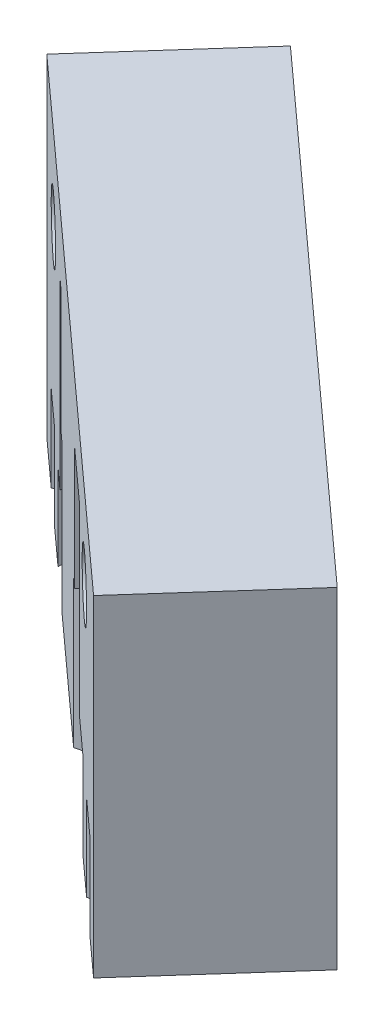
ISO-10303-21;
HEADER;
FILE_DESCRIPTION(('STEP AP214'),'2;1');
FILE_NAME('part.step','',(''),(''),'','','');
FILE_SCHEMA(('AUTOMOTIVE_DESIGN { 1 0 10303 214 1 1 1 1 }'));
ENDSEC;
DATA;
#1=APPLICATION_CONTEXT('core data for automotive mechanical design processes');
#2=APPLICATION_PROTOCOL_DEFINITION('international standard','automotive_design',2000,#1);
#3=PRODUCT_CONTEXT('',#1,'mechanical');
#4=PRODUCT('Part','Part','',(#3));
#5=PRODUCT_RELATED_PRODUCT_CATEGORY('part','',(#4));
#6=PRODUCT_DEFINITION_FORMATION('','',#4);
#7=PRODUCT_DEFINITION_CONTEXT('part definition',#1,'design');
#8=PRODUCT_DEFINITION('design','',#6,#7);
#9=PRODUCT_DEFINITION_SHAPE('','',#8);
#10=(LENGTH_UNIT() NAMED_UNIT(*) SI_UNIT(.MILLI.,.METRE.));
#11=(NAMED_UNIT(*) PLANE_ANGLE_UNIT() SI_UNIT($,.RADIAN.));
#12=(NAMED_UNIT(*) SI_UNIT($,.STERADIAN.) SOLID_ANGLE_UNIT());
#13=UNCERTAINTY_MEASURE_WITH_UNIT(LENGTH_MEASURE(1.E-05),#10,'distance_accuracy_value','');
#14=(GEOMETRIC_REPRESENTATION_CONTEXT(3) GLOBAL_UNCERTAINTY_ASSIGNED_CONTEXT((#13)) GLOBAL_UNIT_ASSIGNED_CONTEXT((#10,
#11,#12)) REPRESENTATION_CONTEXT('',''));
#15=CARTESIAN_POINT('',(0.,0.,0.));
#16=DIRECTION('',(0.,0.,1.));
#17=DIRECTION('',(1.,0.,0.));
#18=AXIS2_PLACEMENT_3D('',#15,#16,#17);
#19=CARTESIAN_POINT('',(0.180321334409129,0.,-0.199266915510276));
#20=DIRECTION('',(0.670979247329059,0.,-0.74147612884956));
#21=DIRECTION('',(-0.74147612884956,0.,-0.670979247329059));
#22=AXIS2_PLACEMENT_3D('',#19,#20,#21);
#23=PLANE('',#22);
#24=CARTESIAN_POINT('',(14.4574317839117,20.2282122973391,12.7204272603554));
#25=DIRECTION('',(0.670979247329059,0.,-0.74147612884956));
#26=DIRECTION('',(-0.74147612884956,0.,-0.670979247329059));
#27=AXIS2_PLACEMENT_3D('',#24,#25,#26);
#28=CIRCLE('',#27,2.5);
#29=CARTESIAN_POINT('',(12.6037414617879,20.2282122973391,11.0429791420328));
#30=VERTEX_POINT('',#29);
#31=EDGE_CURVE('E45',#30,#30,#28,.F.);
#32=ORIENTED_EDGE('',*,*,#31,.F.);
#33=EDGE_LOOP('',(#32));
#34=FACE_BOUND('',#33,.T.);
#35=CARTESIAN_POINT('',(-12.0858954641083,20.2282122973391,-11.299255970875));
#36=DIRECTION('',(0.670979247329059,0.,-0.74147612884956));
#37=DIRECTION('',(-0.74147612884956,0.,-0.670979247329059));
#38=AXIS2_PLACEMENT_3D('',#35,#36,#37);
#39=CIRCLE('',#38,2.5);
#40=CARTESIAN_POINT('',(-13.9395857862322,20.2282122973391,-12.9767040891976));
#41=VERTEX_POINT('',#40);
#42=EDGE_CURVE('E515',#41,#41,#39,.F.);
#43=ORIENTED_EDGE('',*,*,#42,.F.);
#44=EDGE_LOOP('',(#43));
#45=FACE_BOUND('',#44,.T.);
#46=DIRECTION('',(0.,-1.,0.));
#47=VECTOR('',#46,1.);
#48=CARTESIAN_POINT('',(-17.7575242155149,27.,-16.4316466746096));
#49=LINE('',#48,#47);
#50=CARTESIAN_POINT('',(-17.7575242155149,27.,-16.4316466746096));
#51=VERTEX_POINT('',#50);
#52=CARTESIAN_POINT('',(-17.7575242155149,0.,-16.4316466746096));
#53=VERTEX_POINT('',#52);
#54=EDGE_CURVE('E231',#51,#53,#49,.T.);
#55=ORIENTED_EDGE('',*,*,#54,.T.);
#56=DIRECTION('',(0.74147612884956,0.,0.670979247329059));
#57=VECTOR('',#56,1.);
#58=CARTESIAN_POINT('',(0.180321334409129,0.,-0.199266915510276));
#59=LINE('',#58,#57);
#60=CARTESIAN_POINT('',(-13.9430557088245,0.,-12.9798441040392));
#61=VERTEX_POINT('',#60);
#62=EDGE_CURVE('E508',#53,#61,#59,.T.);
#63=ORIENTED_EDGE('',*,*,#62,.T.);
#64=DIRECTION('',(0.,-1.,0.));
#65=VECTOR('',#64,1.);
#66=CARTESIAN_POINT('',(-13.9430557088245,7.,-12.9798441040392));
#67=LINE('',#66,#65);
#68=CARTESIAN_POINT('',(-13.9430557088245,7.,-12.9798441040392));
#69=VERTEX_POINT('',#68);
#70=EDGE_CURVE('E502',#61,#69,#67,.F.);
#71=ORIENTED_EDGE('',*,*,#70,.T.);
#72=DIRECTION('',(-0.74147612884956,0.,-0.670979247329059));
#73=VECTOR('',#72,1.);
#74=CARTESIAN_POINT('',(0.180321334409129,7.,-0.199266915510276));
#75=LINE('',#74,#73);
#76=CARTESIAN_POINT('',(-11.0968622551529,7.,-10.4042564795792));
#77=VERTEX_POINT('',#76);
#78=EDGE_CURVE('E486',#77,#69,#75,.T.);
#79=ORIENTED_EDGE('',*,*,#78,.F.);
#80=DIRECTION('',(0.,-1.,0.));
#81=VECTOR('',#80,1.);
#82=CARTESIAN_POINT('',(-11.0968622551529,7.,-10.4042564795792));
#83=LINE('',#82,#81);
#84=CARTESIAN_POINT('',(-11.0968622551529,0.,-10.4042564795792));
#85=VERTEX_POINT('',#84);
#86=EDGE_CURVE('E478',#85,#77,#83,.F.);
#87=ORIENTED_EDGE('',*,*,#86,.F.);
#88=DIRECTION('',(0.74147612884956,0.,0.670979247329059));
#89=VECTOR('',#88,1.);
#90=CARTESIAN_POINT('',(0.180321334409129,0.,-0.199266915510276));
#91=LINE('',#90,#89);
#92=CARTESIAN_POINT('',(-8.11647189445451,0.,-7.7072309069947));
#93=VERTEX_POINT('',#92);
#94=EDGE_CURVE('E490',#85,#93,#91,.T.);
#95=ORIENTED_EDGE('',*,*,#94,.T.);
#96=DIRECTION('',(0.,-1.,0.));
#97=VECTOR('',#96,1.);
#98=CARTESIAN_POINT('',(-8.11647189445451,7.,-7.7072309069947));
#99=LINE('',#98,#97);
#100=CARTESIAN_POINT('',(-8.11647189445451,7.,-7.7072309069947));
#101=VERTEX_POINT('',#100);
#102=EDGE_CURVE('E483',#101,#93,#99,.T.);
#103=ORIENTED_EDGE('',*,*,#102,.F.);
#104=CARTESIAN_POINT('',(-6.45742945742896,7.,-6.20592425345544));
#105=VERTEX_POINT('',#104);
#106=EDGE_CURVE('E470',#105,#101,#75,.T.);
#107=ORIENTED_EDGE('',*,*,#106,.F.);
#108=DIRECTION('',(0.,-1.,0.));
#109=VECTOR('',#108,1.);
#110=CARTESIAN_POINT('',(-6.45742945742896,22.,-6.20592425345544));
#111=LINE('',#110,#109);
#112=CARTESIAN_POINT('',(-6.45742945742896,22.,-6.20592425345544));
#113=VERTEX_POINT('',#112);
#114=EDGE_CURVE('E467',#113,#105,#111,.T.);
#115=ORIENTED_EDGE('',*,*,#114,.F.);
#116=DIRECTION('',(-0.74147612884956,0.,-0.670979247329059));
#117=VECTOR('',#116,1.);
#118=CARTESIAN_POINT('',(0.180321334409129,22.,-0.199266915510276));
#119=LINE('',#118,#117);
#120=CARTESIAN_POINT('',(-5.74813977065192,22.,-5.56407127713598));
#121=VERTEX_POINT('',#120);
#122=EDGE_CURVE('E466',#121,#113,#119,.T.);
#123=ORIENTED_EDGE('',*,*,#122,.F.);
#124=DIRECTION('',(0.,1.,0.));
#125=VECTOR('',#124,1.);
#126=CARTESIAN_POINT('',(-5.74813977065192,12.,-5.56407127713598));
#127=LINE('',#126,#125);
#128=CARTESIAN_POINT('',(-5.74813977065192,12.,-5.56407127713598));
#129=VERTEX_POINT('',#128);
#130=EDGE_CURVE('E455',#121,#129,#127,.F.);
#131=ORIENTED_EDGE('',*,*,#130,.T.);
#132=DIRECTION('',(-0.74147612884956,0.,-0.670979247329059));
#133=VECTOR('',#132,1.);
#134=CARTESIAN_POINT('',(0.180321334409129,12.,-0.199266915510276));
#135=LINE('',#134,#133);
#136=CARTESIAN_POINT('',(-4.63515238000912,12.,-4.55690272159674));
#137=VERTEX_POINT('',#136);
#138=EDGE_CURVE('E451',#137,#129,#135,.T.);
#139=ORIENTED_EDGE('',*,*,#138,.F.);
#140=DIRECTION('',(0.,-1.,0.));
#141=VECTOR('',#140,1.);
#142=CARTESIAN_POINT('',(-4.63515238000912,7.,-4.55690272159674));
#143=LINE('',#142,#141);
#144=CARTESIAN_POINT('',(-4.63515238000912,0.,-4.55690272159674));
#145=VERTEX_POINT('',#144);
#146=EDGE_CURVE('E444',#145,#137,#143,.F.);
#147=ORIENTED_EDGE('',*,*,#146,.F.);
#148=DIRECTION('',(0.74147612884956,0.,0.670979247329059));
#149=VECTOR('',#148,1.);
#150=CARTESIAN_POINT('',(0.180321334409129,0.,-0.199266915510276));
#151=LINE('',#150,#149);
#152=CARTESIAN_POINT('',(5.2950846684095,0.,4.42920313036783));
#153=VERTEX_POINT('',#152);
#154=EDGE_CURVE('E12',#145,#153,#151,.T.);
#155=ORIENTED_EDGE('',*,*,#154,.T.);
#156=DIRECTION('',(0.,-1.,0.));
#157=VECTOR('',#156,1.);
#158=CARTESIAN_POINT('',(5.2950846684095,7.,4.42920313036783));
#159=LINE('',#158,#157);
#160=CARTESIAN_POINT('',(5.2950846684095,12.,4.42920313036783));
#161=VERTEX_POINT('',#160);
#162=EDGE_CURVE('E65',#161,#153,#159,.T.);
#163=ORIENTED_EDGE('',*,*,#162,.F.);
#164=DIRECTION('',(-0.74147612884956,0.,-0.670979247329059));
#165=VECTOR('',#164,1.);
#166=CARTESIAN_POINT('',(0.180321334409129,12.,-0.199266915510276));
#167=LINE('',#166,#165);
#168=CARTESIAN_POINT('',(6.10878243947018,12.,5.16553744611543));
#169=VERTEX_POINT('',#168);
#170=EDGE_CURVE('E448',#169,#161,#167,.T.);
#171=ORIENTED_EDGE('',*,*,#170,.F.);
#172=DIRECTION('',(0.,1.,0.));
#173=VECTOR('',#172,1.);
#174=CARTESIAN_POINT('',(6.10878243947018,12.,5.16553744611543));
#175=LINE('',#174,#173);
#176=CARTESIAN_POINT('',(6.10878243947018,22.,5.16553744611543));
#177=VERTEX_POINT('',#176);
#178=EDGE_CURVE('E456',#169,#177,#175,.T.);
#179=ORIENTED_EDGE('',*,*,#178,.T.);
#180=CARTESIAN_POINT('',(10.1268477535171,22.,8.80157957240914));
#181=VERTEX_POINT('',#180);
#182=EDGE_CURVE('E452',#181,#177,#119,.T.);
#183=ORIENTED_EDGE('',*,*,#182,.F.);
#184=DIRECTION('',(0.,-1.,0.));
#185=VECTOR('',#184,1.);
#186=CARTESIAN_POINT('',(10.1268477535171,22.,8.80157957240913));
#187=LINE('',#186,#185);
#188=CARTESIAN_POINT('',(10.1268477535171,7.,8.80157957240913));
#189=VERTEX_POINT('',#188);
#190=EDGE_CURVE('E460',#181,#189,#187,.T.);
#191=ORIENTED_EDGE('',*,*,#190,.T.);
#192=DIRECTION('',(-0.74147612884956,0.,-0.670979247329059));
#193=VECTOR('',#192,1.);
#194=CARTESIAN_POINT('',(0.180321334409129,7.,-0.199266915510276));
#195=LINE('',#194,#193);
#196=CARTESIAN_POINT('',(13.5040535540342,7.,11.8576928010605));
#197=VERTEX_POINT('',#196);
#198=EDGE_CURVE('E447',#197,#189,#195,.T.);
#199=ORIENTED_EDGE('',*,*,#198,.F.);
#200=DIRECTION('',(0.,-1.,0.));
#201=VECTOR('',#200,1.);
#202=CARTESIAN_POINT('',(13.5040535540342,7.,11.8576928010605));
#203=LINE('',#202,#201);
#204=CARTESIAN_POINT('',(13.5040535540342,0.,11.8576928010605));
#205=VERTEX_POINT('',#204);
#206=EDGE_CURVE('E479',#205,#197,#203,.F.);
#207=ORIENTED_EDGE('',*,*,#206,.F.);
#208=DIRECTION('',(0.74147612884956,0.,0.670979247329059));
#209=VECTOR('',#208,1.);
#210=CARTESIAN_POINT('',(0.180321334409129,0.,-0.199266915510276));
#211=LINE('',#210,#209);
#212=CARTESIAN_POINT('',(16.3901305800542,0.,14.4693720113638));
#213=VERTEX_POINT('',#212);
#214=EDGE_CURVE('E51',#205,#213,#211,.T.);
#215=ORIENTED_EDGE('',*,*,#214,.T.);
#216=DIRECTION('',(0.,-1.,0.));
#217=VECTOR('',#216,1.);
#218=CARTESIAN_POINT('',(16.3901305800542,7.,14.4693720113638));
#219=LINE('',#218,#217);
#220=CARTESIAN_POINT('',(16.3901305800542,7.,14.4693720113638));
#221=VERTEX_POINT('',#220);
#222=EDGE_CURVE('E482',#221,#213,#219,.T.);
#223=ORIENTED_EDGE('',*,*,#222,.F.);
#224=CARTESIAN_POINT('',(19.241101723208,7.,17.0492830797865));
#225=VERTEX_POINT('',#224);
#226=EDGE_CURVE('E475',#225,#221,#195,.T.);
#227=ORIENTED_EDGE('',*,*,#226,.F.);
#228=DIRECTION('',(0.,-1.,0.));
#229=VECTOR('',#228,1.);
#230=CARTESIAN_POINT('',(19.241101723208,7.,17.0492830797865));
#231=LINE('',#230,#229);
#232=CARTESIAN_POINT('',(19.241101723208,0.,17.0492830797865));
#233=VERTEX_POINT('',#232);
#234=EDGE_CURVE('E474',#225,#233,#231,.T.);
#235=ORIENTED_EDGE('',*,*,#234,.T.);
#236=CARTESIAN_POINT('',(22.3728310041526,0.,19.8832588127975));
#237=VERTEX_POINT('',#236);
#238=EDGE_CURVE('E498',#233,#237,#59,.T.);
#239=ORIENTED_EDGE('',*,*,#238,.T.);
#240=DIRECTION('',(0.,1.,0.));
#241=VECTOR('',#240,1.);
#242=CARTESIAN_POINT('',(22.3728310041526,27.,19.8832588127975));
#243=LINE('',#242,#241);
#244=CARTESIAN_POINT('',(22.3728310041526,27.,19.8832588127975));
#245=VERTEX_POINT('',#244);
#246=EDGE_CURVE('E509',#237,#245,#243,.T.);
#247=ORIENTED_EDGE('',*,*,#246,.T.);
#248=DIRECTION('',(0.74147612884956,0.,0.670979247329059));
#249=VECTOR('',#248,1.);
#250=CARTESIAN_POINT('',(0.180321334409129,27.,-0.199266915510276));
#251=LINE('',#250,#249);
#252=EDGE_CURVE('E283',#51,#245,#251,.T.);
#253=ORIENTED_EDGE('',*,*,#252,.F.);
#254=EDGE_LOOP('',(#55,#63,#71,#79,#87,#95,#103,#107,#115,#123,#131,#139,#147,#155,#163,#171,
#179,#183,#191,#199,#207,#215,#223,#227,#235,#239,#247,#253));
#255=FACE_BOUND('',#254,.T.);
#256=ADVANCED_FACE('F42',(#34,#45,#255),#23,.F.);
#257=CARTESIAN_POINT('',(2.25,12.,0.));
#258=DIRECTION('',(0.,1.,0.));
#259=DIRECTION('',(0.,0.,1.));
#260=AXIS2_PLACEMENT_3D('',#257,#258,#259);
#261=PLANE('',#260);
#262=CARTESIAN_POINT('',(0.,12.,0.));
#263=DIRECTION('',(0.,-1.,0.));
#264=DIRECTION('',(0.,0.,1.));
#265=AXIS2_PLACEMENT_3D('',#262,#263,#264);
#266=CIRCLE('',#265,8.);
#267=CARTESIAN_POINT('',(7.11111111111111,12.,-3.66498277832681));
#268=VERTEX_POINT('',#267);
#269=CARTESIAN_POINT('',(7.11111111111111,12.,3.66498277832681));
#270=VERTEX_POINT('',#269);
#271=EDGE_CURVE('E278',#268,#270,#266,.T.);
#272=ORIENTED_EDGE('',*,*,#271,.T.);
#273=CARTESIAN_POINT('',(4.5,12.,0.));
#274=DIRECTION('',(0.,1.,0.));
#275=DIRECTION('',(0.,0.,1.));
#276=AXIS2_PLACEMENT_3D('',#273,#274,#275);
#277=CIRCLE('',#276,4.5);
#278=EDGE_CURVE('E274',#270,#268,#277,.T.);
#279=ORIENTED_EDGE('',*,*,#278,.T.);
#280=EDGE_LOOP('',(#272,#279));
#281=FACE_BOUND('',#280,.T.);
#282=ADVANCED_FACE('F533',(#281),#261,.T.);
#283=CARTESIAN_POINT('',(0.,12.,0.));
#284=DIRECTION('',(0.,1.,0.));
#285=DIRECTION('',(0.,0.,1.));
#286=AXIS2_PLACEMENT_3D('',#283,#284,#285);
#287=CYLINDRICAL_SURFACE('',#286,8.);
#288=ORIENTED_EDGE('',*,*,#130,.F.);
#289=CARTESIAN_POINT('',(0.,22.,0.));
#290=DIRECTION('',(0.,1.,0.));
#291=DIRECTION('',(0.,0.,1.));
#292=AXIS2_PLACEMENT_3D('',#289,#290,#291);
#293=CIRCLE('',#292,8.);
#294=EDGE_CURVE('E404',#177,#121,#293,.T.);
#295=ORIENTED_EDGE('',*,*,#294,.F.);
#296=ORIENTED_EDGE('',*,*,#178,.F.);
#297=CARTESIAN_POINT('',(0.,12.,0.));
#298=DIRECTION('',(0.,1.,0.));
#299=DIRECTION('',(0.,0.,1.));
#300=AXIS2_PLACEMENT_3D('',#297,#298,#299);
#301=CIRCLE('',#300,8.);
#302=EDGE_CURVE('E279',#169,#270,#301,.T.);
#303=ORIENTED_EDGE('',*,*,#302,.T.);
#304=ORIENTED_EDGE('',*,*,#271,.F.);
#305=EDGE_CURVE('E286',#268,#129,#301,.T.);
#306=ORIENTED_EDGE('',*,*,#305,.T.);
#307=EDGE_LOOP('',(#288,#295,#296,#303,#304,#306));
#308=FACE_BOUND('',#307,.T.);
#309=ADVANCED_FACE('F600',(#308),#287,.T.);
#310=CARTESIAN_POINT('',(0.,12.,0.));
#311=DIRECTION('',(0.,1.,0.));
#312=DIRECTION('',(0.,0.,1.));
#313=AXIS2_PLACEMENT_3D('',#310,#311,#312);
#314=PLANE('',#313);
#315=CARTESIAN_POINT('',(0.,12.,0.));
#316=DIRECTION('',(0.,1.,0.));
#317=DIRECTION('',(0.,0.,1.));
#318=AXIS2_PLACEMENT_3D('',#315,#316,#317);
#319=CIRCLE('',#318,6.5);
#320=CARTESIAN_POINT('',(4.69444444444444,12.,-4.49579707705149));
#321=VERTEX_POINT('',#320);
#322=EDGE_CURVE('E291',#321,#137,#319,.T.);
#323=ORIENTED_EDGE('',*,*,#322,.T.);
#324=ORIENTED_EDGE('',*,*,#138,.T.);
#325=ORIENTED_EDGE('',*,*,#305,.F.);
#326=CARTESIAN_POINT('',(4.5,12.,0.));
#327=DIRECTION('',(0.,1.,0.));
#328=DIRECTION('',(0.,0.,1.));
#329=AXIS2_PLACEMENT_3D('',#326,#327,#328);
#330=CIRCLE('',#329,4.5);
#331=EDGE_CURVE('E292',#268,#321,#330,.T.);
#332=ORIENTED_EDGE('',*,*,#331,.T.);
#333=EDGE_LOOP('',(#323,#324,#325,#332));
#334=FACE_BOUND('',#333,.T.);
#335=ADVANCED_FACE('F606',(#334),#314,.F.);
#336=ORIENTED_EDGE('',*,*,#302,.F.);
#337=ORIENTED_EDGE('',*,*,#170,.T.);
#338=EDGE_CURVE('E287',#161,#270,#330,.T.);
#339=ORIENTED_EDGE('',*,*,#338,.T.);
#340=EDGE_LOOP('',(#336,#337,#339));
#341=FACE_BOUND('',#340,.T.);
#342=ADVANCED_FACE('F602',(#341),#314,.F.);
#343=CARTESIAN_POINT('',(0.,22.,0.));
#344=DIRECTION('',(0.,1.,0.));
#345=DIRECTION('',(0.,0.,1.));
#346=AXIS2_PLACEMENT_3D('',#343,#344,#345);
#347=PLANE('',#346);
#348=CARTESIAN_POINT('',(2.81741341811794,22.,1.18386679753758));
#349=DIRECTION('',(0.,1.,0.));
#350=DIRECTION('',(0.,0.,1.));
#351=AXIS2_PLACEMENT_3D('',#348,#349,#350);
#352=CIRCLE('',#351,10.5573376484771);
#353=CARTESIAN_POINT('',(11.4516960215957,22.,-4.89120868736258));
#354=VERTEX_POINT('',#353);
#355=EDGE_CURVE('E300',#181,#354,#352,.T.);
#356=ORIENTED_EDGE('',*,*,#355,.F.);
#357=ORIENTED_EDGE('',*,*,#182,.T.);
#358=ORIENTED_EDGE('',*,*,#294,.T.);
#359=ORIENTED_EDGE('',*,*,#122,.T.);
#360=CARTESIAN_POINT('',(-10.6043370878193,22.,-7.95325281586443));
#361=DIRECTION('',(0.,1.,0.));
#362=DIRECTION('',(0.,0.,1.));
#363=AXIS2_PLACEMENT_3D('',#360,#361,#362);
#364=CIRCLE('',#363,4.5);
#365=CARTESIAN_POINT('',(-6.20762315661234,22.,-8.91184898064422));
#366=VERTEX_POINT('',#365);
#367=EDGE_CURVE('E296',#113,#366,#364,.T.);
#368=ORIENTED_EDGE('',*,*,#367,.T.);
#369=CARTESIAN_POINT('',(-4.25352807607591,22.,-9.33789172054634));
#370=DIRECTION('',(0.,1.,0.));
#371=DIRECTION('',(0.,0.,1.));
#372=AXIS2_PLACEMENT_3D('',#369,#370,#371);
#373=CIRCLE('',#372,2.);
#374=CARTESIAN_POINT('',(-3.89522326654847,22.,-11.3055343871577));
#375=VERTEX_POINT('',#374);
#376=EDGE_CURVE('E317',#375,#366,#373,.T.);
#377=ORIENTED_EDGE('',*,*,#376,.F.);
#378=DIRECTION('',(0.983821333305686,0.,0.179152404763717));
#379=VECTOR('',#378,1.);
#380=CARTESIAN_POINT('',(1.86762571380427,22.,-10.25612814014));
#381=LINE('',#380,#379);
#382=CARTESIAN_POINT('',(3.10184507129618,22.,-10.0313786267729));
#383=VERTEX_POINT('',#382);
#384=EDGE_CURVE('E314',#375,#383,#381,.T.);
#385=ORIENTED_EDGE('',*,*,#384,.T.);
#386=CARTESIAN_POINT('',(0.,22.,0.));
#387=DIRECTION('',(0.,1.,0.));
#388=DIRECTION('',(0.,0.,1.));
#389=AXIS2_PLACEMENT_3D('',#386,#387,#388);
#390=CIRCLE('',#389,10.5);
#391=CARTESIAN_POINT('',(4.85530679933662,22.,-9.30999440839335));
#392=VERTEX_POINT('',#391);
#393=EDGE_CURVE('E310',#392,#383,#390,.T.);
#394=ORIENTED_EDGE('',*,*,#393,.F.);
#395=CARTESIAN_POINT('',(46.472222222222,22.,-89.1099464803364));
#396=DIRECTION('',(0.,1.,0.));
#397=DIRECTION('',(0.,0.,1.));
#398=AXIS2_PLACEMENT_3D('',#395,#396,#397);
#399=CIRCLE('',#398,90.);
#400=CARTESIAN_POINT('',(8.1219684151156,22.,-7.68969081302395));
#401=VERTEX_POINT('',#400);
#402=EDGE_CURVE('E307',#401,#392,#399,.F.);
#403=ORIENTED_EDGE('',*,*,#402,.F.);
#404=CARTESIAN_POINT('',(4.5,22.,0.));
#405=DIRECTION('',(0.,1.,0.));
#406=DIRECTION('',(0.,0.,1.));
#407=AXIS2_PLACEMENT_3D('',#404,#405,#406);
#408=CIRCLE('',#407,8.5);
#409=EDGE_CURVE('E303',#354,#401,#408,.T.);
#410=ORIENTED_EDGE('',*,*,#409,.F.);
#411=EDGE_LOOP('',(#356,#357,#358,#359,#368,#377,#385,#394,#403,#410));
#412=FACE_BOUND('',#411,.T.);
#413=ADVANCED_FACE('F605',(#412),#347,.F.);
#414=CARTESIAN_POINT('',(-4.25352807607591,22.,-9.33789172054634));
#415=DIRECTION('',(0.,-1.,0.));
#416=DIRECTION('',(0.,0.,-1.));
#417=AXIS2_PLACEMENT_3D('',#414,#415,#416);
#418=CYLINDRICAL_SURFACE('',#417,2.);
#419=CARTESIAN_POINT('',(-4.25352807607591,7.,-9.33789172054634));
#420=DIRECTION('',(0.,1.,0.));
#421=DIRECTION('',(0.,0.,1.));
#422=AXIS2_PLACEMENT_3D('',#419,#420,#421);
#423=CIRCLE('',#422,2.);
#424=CARTESIAN_POINT('',(-3.89522326654847,7.,-11.3055343871577));
#425=VERTEX_POINT('',#424);
#426=CARTESIAN_POINT('',(-6.20762315661234,7.,-8.91184898064422));
#427=VERTEX_POINT('',#426);
#428=EDGE_CURVE('E299',#425,#427,#423,.T.);
#429=ORIENTED_EDGE('',*,*,#428,.F.);
#430=DIRECTION('',(0.,-1.,0.));
#431=VECTOR('',#430,1.);
#432=CARTESIAN_POINT('',(-3.89522326654847,22.,-11.3055343871577));
#433=LINE('',#432,#431);
#434=EDGE_CURVE('E337',#375,#425,#433,.T.);
#435=ORIENTED_EDGE('',*,*,#434,.F.);
#436=ORIENTED_EDGE('',*,*,#376,.T.);
#437=DIRECTION('',(0.,-1.,0.));
#438=VECTOR('',#437,1.);
#439=CARTESIAN_POINT('',(-6.20762315661234,22.,-8.91184898064422));
#440=LINE('',#439,#438);
#441=EDGE_CURVE('E321',#366,#427,#440,.T.);
#442=ORIENTED_EDGE('',*,*,#441,.T.);
#443=EDGE_LOOP('',(#429,#435,#436,#442));
#444=FACE_BOUND('',#443,.T.);
#445=ADVANCED_FACE('F613',(#444),#418,.F.);
#446=CARTESIAN_POINT('',(1.86762571380427,22.,-10.25612814014));
#447=DIRECTION('',(0.179152404763717,0.,-0.983821333305686));
#448=DIRECTION('',(-0.983821333305686,0.,-0.179152404763717));
#449=AXIS2_PLACEMENT_3D('',#446,#447,#448);
#450=PLANE('',#449);
#451=DIRECTION('',(0.983821333305686,0.,0.179152404763717));
#452=VECTOR('',#451,1.);
#453=CARTESIAN_POINT('',(1.86762571380427,7.,-10.25612814014));
#454=LINE('',#453,#452);
#455=CARTESIAN_POINT('',(3.10184507129618,7.,-10.0313786267729));
#456=VERTEX_POINT('',#455);
#457=EDGE_CURVE('E328',#425,#456,#454,.T.);
#458=ORIENTED_EDGE('',*,*,#457,.T.);
#459=DIRECTION('',(0.,-1.,0.));
#460=VECTOR('',#459,1.);
#461=CARTESIAN_POINT('',(3.10184507129618,22.,-10.0313786267729));
#462=LINE('',#461,#460);
#463=EDGE_CURVE('E340',#383,#456,#462,.T.);
#464=ORIENTED_EDGE('',*,*,#463,.F.);
#465=ORIENTED_EDGE('',*,*,#384,.F.);
#466=ORIENTED_EDGE('',*,*,#434,.T.);
#467=EDGE_LOOP('',(#458,#464,#465,#466));
#468=FACE_BOUND('',#467,.T.);
#469=ADVANCED_FACE('F617',(#468),#450,.F.);
#470=CARTESIAN_POINT('',(2.81741341811794,22.,1.18386679753758));
#471=DIRECTION('',(0.,-1.,0.));
#472=DIRECTION('',(0.,0.,-1.));
#473=AXIS2_PLACEMENT_3D('',#470,#471,#472);
#474=CYLINDRICAL_SURFACE('',#473,10.5573376484771);
#475=ORIENTED_EDGE('',*,*,#190,.F.);
#476=ORIENTED_EDGE('',*,*,#355,.T.);
#477=DIRECTION('',(0.,-1.,0.));
#478=VECTOR('',#477,1.);
#479=CARTESIAN_POINT('',(11.4516960215957,22.,-4.89120868736258));
#480=LINE('',#479,#478);
#481=CARTESIAN_POINT('',(11.4516960215957,7.,-4.89120868736258));
#482=VERTEX_POINT('',#481);
#483=EDGE_CURVE('E344',#354,#482,#480,.T.);
#484=ORIENTED_EDGE('',*,*,#483,.T.);
#485=CARTESIAN_POINT('',(2.81741341811794,7.,1.18386679753758));
#486=DIRECTION('',(0.,1.,0.));
#487=DIRECTION('',(0.,0.,1.));
#488=AXIS2_PLACEMENT_3D('',#485,#486,#487);
#489=CIRCLE('',#488,10.5573376484771);
#490=EDGE_CURVE('E325',#189,#482,#489,.T.);
#491=ORIENTED_EDGE('',*,*,#490,.F.);
#492=EDGE_LOOP('',(#475,#476,#484,#491));
#493=FACE_BOUND('',#492,.T.);
#494=ADVANCED_FACE('F553',(#493),#474,.F.);
#495=CARTESIAN_POINT('',(-10.6043370878193,22.,-7.95325281586443));
#496=DIRECTION('',(0.,-1.,0.));
#497=DIRECTION('',(0.,0.,-1.));
#498=AXIS2_PLACEMENT_3D('',#495,#496,#497);
#499=CYLINDRICAL_SURFACE('',#498,4.5);
#500=ORIENTED_EDGE('',*,*,#367,.F.);
#501=ORIENTED_EDGE('',*,*,#114,.T.);
#502=CARTESIAN_POINT('',(-10.6043370878193,7.,-7.95325281586443));
#503=DIRECTION('',(0.,1.,0.));
#504=DIRECTION('',(0.,0.,1.));
#505=AXIS2_PLACEMENT_3D('',#502,#503,#504);
#506=CIRCLE('',#505,4.5);
#507=EDGE_CURVE('E322',#105,#427,#506,.T.);
#508=ORIENTED_EDGE('',*,*,#507,.T.);
#509=ORIENTED_EDGE('',*,*,#441,.F.);
#510=EDGE_LOOP('',(#500,#501,#508,#509));
#511=FACE_BOUND('',#510,.T.);
#512=ADVANCED_FACE('F624',(#511),#499,.T.);
#513=CARTESIAN_POINT('',(46.472222222222,7.,-89.1099464803364));
#514=DIRECTION('',(0.,1.,0.));
#515=DIRECTION('',(0.,0.,1.));
#516=AXIS2_PLACEMENT_3D('',#513,#514,#515);
#517=CYLINDRICAL_SURFACE('',#516,90.);
#518=DIRECTION('',(0.,-1.,0.));
#519=VECTOR('',#518,1.);
#520=CARTESIAN_POINT('',(4.85530679933662,7.,-9.30999440839336));
#521=LINE('',#520,#519);
#522=CARTESIAN_POINT('',(4.85530679933661,0.,-9.30999440839335));
#523=VERTEX_POINT('',#522);
#524=EDGE_CURVE('E426',#392,#523,#521,.T.);
#525=ORIENTED_EDGE('',*,*,#524,.T.);
#526=CARTESIAN_POINT('',(46.472222222222,0.,-89.1099464803364));
#527=DIRECTION('',(0.,1.,0.));
#528=DIRECTION('',(0.,0.,1.));
#529=AXIS2_PLACEMENT_3D('',#526,#527,#528);
#530=CIRCLE('',#529,90.);
#531=CARTESIAN_POINT('',(8.1219684151156,0.,-7.68969081302395));
#532=VERTEX_POINT('',#531);
#533=EDGE_CURVE('E392',#523,#532,#530,.T.);
#534=ORIENTED_EDGE('',*,*,#533,.T.);
#535=DIRECTION('',(0.,-1.,0.));
#536=VECTOR('',#535,1.);
#537=CARTESIAN_POINT('',(8.1219684151156,7.,-7.68969081302395));
#538=LINE('',#537,#536);
#539=EDGE_CURVE('E433',#532,#401,#538,.F.);
#540=ORIENTED_EDGE('',*,*,#539,.T.);
#541=ORIENTED_EDGE('',*,*,#402,.T.);
#542=EDGE_LOOP('',(#525,#534,#540,#541));
#543=FACE_BOUND('',#542,.T.);
#544=ADVANCED_FACE('F627',(#543),#517,.T.);
#545=CARTESIAN_POINT('',(0.,7.,0.));
#546=DIRECTION('',(0.,1.,0.));
#547=DIRECTION('',(0.,0.,1.));
#548=AXIS2_PLACEMENT_3D('',#545,#546,#547);
#549=PLANE('',#548);
#550=ORIENTED_EDGE('',*,*,#507,.F.);
#551=ORIENTED_EDGE('',*,*,#106,.T.);
#552=CARTESIAN_POINT('',(-10.6043370878193,7.,-7.95325281586443));
#553=DIRECTION('',(0.,1.,0.));
#554=DIRECTION('',(0.,0.,1.));
#555=AXIS2_PLACEMENT_3D('',#552,#553,#554);
#556=CIRCLE('',#555,2.5);
#557=EDGE_CURVE('E352',#101,#77,#556,.T.);
#558=ORIENTED_EDGE('',*,*,#557,.T.);
#559=ORIENTED_EDGE('',*,*,#78,.T.);
#560=CARTESIAN_POINT('',(-10.6043370878193,7.,-7.95325281586443));
#561=DIRECTION('',(0.,1.,0.));
#562=DIRECTION('',(0.,0.,1.));
#563=AXIS2_PLACEMENT_3D('',#560,#561,#562);
#564=CIRCLE('',#563,6.03437337331733);
#565=CARTESIAN_POINT('',(-8.82169982054453,7.,-13.7183084428228));
#566=VERTEX_POINT('',#565);
#567=EDGE_CURVE('E360',#566,#69,#564,.T.);
#568=ORIENTED_EDGE('',*,*,#567,.F.);
#569=DIRECTION('',(0.955369393025988,0.,0.295413816313921));
#570=VECTOR('',#569,1.);
#571=CARTESIAN_POINT('',(3.10184507129617,7.,-10.0313786267729));
#572=LINE('',#571,#570);
#573=EDGE_CURVE('E356',#566,#456,#572,.T.);
#574=ORIENTED_EDGE('',*,*,#573,.T.);
#575=ORIENTED_EDGE('',*,*,#457,.F.);
#576=ORIENTED_EDGE('',*,*,#428,.T.);
#577=EDGE_LOOP('',(#550,#551,#558,#559,#568,#574,#575,#576));
#578=FACE_BOUND('',#577,.T.);
#579=ADVANCED_FACE('F629',(#578),#549,.F.);
#580=CARTESIAN_POINT('',(0.,7.,0.));
#581=DIRECTION('',(0.,-1.,0.));
#582=DIRECTION('',(0.,0.,-1.));
#583=AXIS2_PLACEMENT_3D('',#580,#581,#582);
#584=CYLINDRICAL_SURFACE('',#583,10.5);
#585=DIRECTION('',(0.,-1.,0.));
#586=VECTOR('',#585,1.);
#587=CARTESIAN_POINT('',(3.10184507129617,7.,-10.0313786267729));
#588=LINE('',#587,#586);
#589=CARTESIAN_POINT('',(3.10184507129618,0.,-10.0313786267729));
#590=VERTEX_POINT('',#589);
#591=EDGE_CURVE('E410',#456,#590,#588,.T.);
#592=ORIENTED_EDGE('',*,*,#591,.T.);
#593=CARTESIAN_POINT('',(0.,0.,0.));
#594=DIRECTION('',(0.,1.,0.));
#595=DIRECTION('',(0.,0.,1.));
#596=AXIS2_PLACEMENT_3D('',#593,#594,#595);
#597=CIRCLE('',#596,10.5);
#598=EDGE_CURVE('E377',#523,#590,#597,.T.);
#599=ORIENTED_EDGE('',*,*,#598,.F.);
#600=ORIENTED_EDGE('',*,*,#524,.F.);
#601=ORIENTED_EDGE('',*,*,#393,.T.);
#602=ORIENTED_EDGE('',*,*,#463,.T.);
#603=EDGE_LOOP('',(#592,#599,#600,#601,#602));
#604=FACE_BOUND('',#603,.T.);
#605=ADVANCED_FACE('F632',(#604),#584,.F.);
#606=CARTESIAN_POINT('',(16.0000000000001,7.,12.));
#607=DIRECTION('',(0.,-1.,0.));
#608=DIRECTION('',(0.,0.,-1.));
#609=AXIS2_PLACEMENT_3D('',#606,#607,#608);
#610=CYLINDRICAL_SURFACE('',#609,2.5);
#611=CARTESIAN_POINT('',(16.0000000000001,7.,12.));
#612=DIRECTION('',(0.,1.,0.));
#613=DIRECTION('',(0.,0.,1.));
#614=AXIS2_PLACEMENT_3D('',#611,#612,#613);
#615=CIRCLE('',#614,2.5);
#616=EDGE_CURVE('E348',#221,#197,#615,.T.);
#617=ORIENTED_EDGE('',*,*,#616,.F.);
#618=ORIENTED_EDGE('',*,*,#222,.T.);
#619=CARTESIAN_POINT('',(16.0000000000001,0.,12.));
#620=DIRECTION('',(0.,1.,0.));
#621=DIRECTION('',(0.,0.,1.));
#622=AXIS2_PLACEMENT_3D('',#619,#620,#621);
#623=CIRCLE('',#622,2.5);
#624=EDGE_CURVE('E380',#213,#205,#623,.T.);
#625=ORIENTED_EDGE('',*,*,#624,.T.);
#626=ORIENTED_EDGE('',*,*,#206,.T.);
#627=EDGE_LOOP('',(#617,#618,#625,#626));
#628=FACE_BOUND('',#627,.T.);
#629=ADVANCED_FACE('F572',(#628),#610,.T.);
#630=CARTESIAN_POINT('',(-10.6043370878193,7.,-7.95325281586443));
#631=DIRECTION('',(0.,-1.,0.));
#632=DIRECTION('',(0.,0.,-1.));
#633=AXIS2_PLACEMENT_3D('',#630,#631,#632);
#634=CYLINDRICAL_SURFACE('',#633,2.5);
#635=ORIENTED_EDGE('',*,*,#557,.F.);
#636=ORIENTED_EDGE('',*,*,#102,.T.);
#637=CARTESIAN_POINT('',(-10.6043370878193,0.,-7.95325281586443));
#638=DIRECTION('',(0.,1.,0.));
#639=DIRECTION('',(0.,0.,1.));
#640=AXIS2_PLACEMENT_3D('',#637,#638,#639);
#641=CIRCLE('',#640,2.5);
#642=EDGE_CURVE('E384',#93,#85,#641,.T.);
#643=ORIENTED_EDGE('',*,*,#642,.T.);
#644=ORIENTED_EDGE('',*,*,#86,.T.);
#645=EDGE_LOOP('',(#635,#636,#643,#644));
#646=FACE_BOUND('',#645,.T.);
#647=ADVANCED_FACE('F639',(#646),#634,.T.);
#648=CARTESIAN_POINT('',(4.5,7.,0.));
#649=DIRECTION('',(0.,-1.,0.));
#650=DIRECTION('',(0.,0.,-1.));
#651=AXIS2_PLACEMENT_3D('',#648,#649,#650);
#652=CYLINDRICAL_SURFACE('',#651,8.5);
#653=CARTESIAN_POINT('',(4.5,0.,0.));
#654=DIRECTION('',(0.,1.,0.));
#655=DIRECTION('',(0.,0.,1.));
#656=AXIS2_PLACEMENT_3D('',#653,#654,#655);
#657=CIRCLE('',#656,8.5);
#658=CARTESIAN_POINT('',(11.4516960215957,0.,-4.89120868736257));
#659=VERTEX_POINT('',#658);
#660=EDGE_CURVE('E399',#659,#532,#657,.T.);
#661=ORIENTED_EDGE('',*,*,#660,.F.);
#662=DIRECTION('',(0.,-1.,0.));
#663=VECTOR('',#662,1.);
#664=CARTESIAN_POINT('',(11.4516960215957,7.,-4.89120868736258));
#665=LINE('',#664,#663);
#666=EDGE_CURVE('E414',#482,#659,#665,.T.);
#667=ORIENTED_EDGE('',*,*,#666,.F.);
#668=ORIENTED_EDGE('',*,*,#483,.F.);
#669=ORIENTED_EDGE('',*,*,#409,.T.);
#670=ORIENTED_EDGE('',*,*,#539,.F.);
#671=EDGE_LOOP('',(#661,#667,#668,#669,#670));
#672=FACE_BOUND('',#671,.T.);
#673=ADVANCED_FACE('F559',(#672),#652,.F.);
#674=CARTESIAN_POINT('',(9.96162472879303,7.,-7.00899251957429));
#675=DIRECTION('',(0.81784659077596,0.,-0.575436316160303));
#676=DIRECTION('',(-0.575436316160303,0.,-0.81784659077596));
#677=AXIS2_PLACEMENT_3D('',#674,#675,#676);
#678=PLANE('',#677);
#679=DIRECTION('',(0.575436316160303,0.,0.81784659077596));
#680=VECTOR('',#679,1.);
#681=CARTESIAN_POINT('',(9.96162472879303,0.,-7.00899251957429));
#682=LINE('',#681,#680);
#683=CARTESIAN_POINT('',(20.9070795446559,0.,8.54738210303818));
#684=VERTEX_POINT('',#683);
#685=EDGE_CURVE('E400',#659,#684,#682,.T.);
#686=ORIENTED_EDGE('',*,*,#685,.T.);
#687=DIRECTION('',(0.,-1.,0.));
#688=VECTOR('',#687,1.);
#689=CARTESIAN_POINT('',(20.9070795446559,7.,8.54738210303818));
#690=LINE('',#689,#688);
#691=CARTESIAN_POINT('',(20.9070795446559,7.,8.54738210303818));
#692=VERTEX_POINT('',#691);
#693=EDGE_CURVE('E418',#692,#684,#690,.T.);
#694=ORIENTED_EDGE('',*,*,#693,.F.);
#695=DIRECTION('',(0.575436316160303,0.,0.81784659077596));
#696=VECTOR('',#695,1.);
#697=CARTESIAN_POINT('',(9.96162472879303,7.,-7.00899251957429));
#698=LINE('',#697,#696);
#699=EDGE_CURVE('E367',#482,#692,#698,.T.);
#700=ORIENTED_EDGE('',*,*,#699,.F.);
#701=ORIENTED_EDGE('',*,*,#666,.T.);
#702=EDGE_LOOP('',(#686,#694,#700,#701));
#703=FACE_BOUND('',#702,.T.);
#704=ADVANCED_FACE('F564',(#703),#678,.F.);
#705=CARTESIAN_POINT('',(16.0000000000001,7.,12.));
#706=DIRECTION('',(0.,-1.,0.));
#707=DIRECTION('',(0.,0.,-1.));
#708=AXIS2_PLACEMENT_3D('',#705,#706,#707);
#709=CYLINDRICAL_SURFACE('',#708,6.);
#710=ORIENTED_EDGE('',*,*,#234,.F.);
#711=CARTESIAN_POINT('',(16.0000000000001,7.,12.));
#712=DIRECTION('',(0.,1.,0.));
#713=DIRECTION('',(0.,0.,1.));
#714=AXIS2_PLACEMENT_3D('',#711,#712,#713);
#715=CIRCLE('',#714,6.);
#716=EDGE_CURVE('E364',#225,#692,#715,.T.);
#717=ORIENTED_EDGE('',*,*,#716,.T.);
#718=ORIENTED_EDGE('',*,*,#693,.T.);
#719=CARTESIAN_POINT('',(16.0000000000001,0.,12.));
#720=DIRECTION('',(0.,1.,0.));
#721=DIRECTION('',(0.,0.,1.));
#722=AXIS2_PLACEMENT_3D('',#719,#720,#721);
#723=CIRCLE('',#722,6.);
#724=EDGE_CURVE('E396',#233,#684,#723,.T.);
#725=ORIENTED_EDGE('',*,*,#724,.F.);
#726=EDGE_LOOP('',(#710,#717,#718,#725));
#727=FACE_BOUND('',#726,.T.);
#728=ADVANCED_FACE('F568',(#727),#709,.F.);
#729=CARTESIAN_POINT('',(-10.6043370878193,7.,-7.95325281586443));
#730=DIRECTION('',(0.,-1.,0.));
#731=DIRECTION('',(0.,0.,-1.));
#732=AXIS2_PLACEMENT_3D('',#729,#730,#731);
#733=CYLINDRICAL_SURFACE('',#732,6.03437337331733);
#734=ORIENTED_EDGE('',*,*,#70,.F.);
#735=CARTESIAN_POINT('',(-10.6043370878193,0.,-7.95325281586443));
#736=DIRECTION('',(0.,1.,0.));
#737=DIRECTION('',(0.,0.,1.));
#738=AXIS2_PLACEMENT_3D('',#735,#736,#737);
#739=CIRCLE('',#738,6.03437337331733);
#740=CARTESIAN_POINT('',(-8.82169982054453,0.,-13.7183084428228));
#741=VERTEX_POINT('',#740);
#742=EDGE_CURVE('E265',#741,#61,#739,.T.);
#743=ORIENTED_EDGE('',*,*,#742,.F.);
#744=DIRECTION('',(0.,-1.,0.));
#745=VECTOR('',#744,1.);
#746=CARTESIAN_POINT('',(-8.82169982054453,7.,-13.7183084428228));
#747=LINE('',#746,#745);
#748=EDGE_CURVE('E422',#566,#741,#747,.T.);
#749=ORIENTED_EDGE('',*,*,#748,.F.);
#750=ORIENTED_EDGE('',*,*,#567,.T.);
#751=EDGE_LOOP('',(#734,#743,#749,#750));
#752=FACE_BOUND('',#751,.T.);
#753=ADVANCED_FACE('F644',(#752),#733,.F.);
#754=CARTESIAN_POINT('',(3.10184507129617,7.,-10.0313786267729));
#755=DIRECTION('',(0.295413816313921,0.,-0.955369393025988));
#756=DIRECTION('',(-0.955369393025988,0.,-0.295413816313921));
#757=AXIS2_PLACEMENT_3D('',#754,#755,#756);
#758=PLANE('',#757);
#759=DIRECTION('',(0.955369393025988,0.,0.295413816313921));
#760=VECTOR('',#759,1.);
#761=CARTESIAN_POINT('',(3.10184507129617,0.,-10.0313786267729));
#762=LINE('',#761,#760);
#763=EDGE_CURVE('E388',#741,#590,#762,.T.);
#764=ORIENTED_EDGE('',*,*,#763,.T.);
#765=ORIENTED_EDGE('',*,*,#591,.F.);
#766=ORIENTED_EDGE('',*,*,#573,.F.);
#767=ORIENTED_EDGE('',*,*,#748,.T.);
#768=EDGE_LOOP('',(#764,#765,#766,#767));
#769=FACE_BOUND('',#768,.T.);
#770=ADVANCED_FACE('F647',(#769),#758,.F.);
#771=ORIENTED_EDGE('',*,*,#716,.F.);
#772=ORIENTED_EDGE('',*,*,#226,.T.);
#773=ORIENTED_EDGE('',*,*,#616,.T.);
#774=ORIENTED_EDGE('',*,*,#198,.T.);
#775=ORIENTED_EDGE('',*,*,#490,.T.);
#776=ORIENTED_EDGE('',*,*,#699,.T.);
#777=EDGE_LOOP('',(#771,#772,#773,#774,#775,#776));
#778=FACE_BOUND('',#777,.T.);
#779=ADVANCED_FACE('F546',(#778),#549,.F.);
#780=CARTESIAN_POINT('',(0.,7.,0.));
#781=DIRECTION('',(0.,-1.,0.));
#782=DIRECTION('',(0.,0.,-1.));
#783=AXIS2_PLACEMENT_3D('',#780,#781,#782);
#784=CYLINDRICAL_SURFACE('',#783,6.5);
#785=CARTESIAN_POINT('',(0.,0.,0.));
#786=DIRECTION('',(0.,1.,0.));
#787=DIRECTION('',(0.,0.,1.));
#788=AXIS2_PLACEMENT_3D('',#785,#786,#787);
#789=CIRCLE('',#788,6.5);
#790=CARTESIAN_POINT('',(4.69444444444444,0.,-4.49579707705149));
#791=VERTEX_POINT('',#790);
#792=EDGE_CURVE('E372',#791,#145,#789,.T.);
#793=ORIENTED_EDGE('',*,*,#792,.T.);
#794=ORIENTED_EDGE('',*,*,#146,.T.);
#795=ORIENTED_EDGE('',*,*,#322,.F.);
#796=DIRECTION('',(0.,-1.,0.));
#797=VECTOR('',#796,1.);
#798=CARTESIAN_POINT('',(4.69444444444444,7.,-4.49579707705149));
#799=LINE('',#798,#797);
#800=EDGE_CURVE('E371',#321,#791,#799,.T.);
#801=ORIENTED_EDGE('',*,*,#800,.T.);
#802=EDGE_LOOP('',(#793,#794,#795,#801));
#803=FACE_BOUND('',#802,.T.);
#804=ADVANCED_FACE('F659',(#803),#784,.T.);
#805=CARTESIAN_POINT('',(4.5,7.,0.));
#806=DIRECTION('',(0.,-1.,0.));
#807=DIRECTION('',(0.,0.,-1.));
#808=AXIS2_PLACEMENT_3D('',#805,#806,#807);
#809=CYLINDRICAL_SURFACE('',#808,4.5);
#810=ORIENTED_EDGE('',*,*,#338,.F.);
#811=ORIENTED_EDGE('',*,*,#162,.T.);
#812=CARTESIAN_POINT('',(4.5,0.,0.));
#813=DIRECTION('',(0.,1.,0.));
#814=DIRECTION('',(0.,0.,1.));
#815=AXIS2_PLACEMENT_3D('',#812,#813,#814);
#816=CIRCLE('',#815,4.5);
#817=EDGE_CURVE('E376',#153,#791,#816,.T.);
#818=ORIENTED_EDGE('',*,*,#817,.T.);
#819=ORIENTED_EDGE('',*,*,#800,.F.);
#820=ORIENTED_EDGE('',*,*,#331,.F.);
#821=ORIENTED_EDGE('',*,*,#278,.F.);
#822=EDGE_LOOP('',(#810,#811,#818,#819,#820,#821));
#823=FACE_BOUND('',#822,.T.);
#824=ADVANCED_FACE('F583',(#823),#809,.T.);
#825=CARTESIAN_POINT('',(29.8446064601903,20.2282122973391,-4.28341117177975));
#826=DIRECTION('',(-0.670979247329059,0.,0.74147612884956));
#827=DIRECTION('',(0.74147612884956,0.,0.670979247329059));
#828=AXIS2_PLACEMENT_3D('',#825,#826,#827);
#829=CYLINDRICAL_SURFACE('',#828,2.5);
#830=ORIENTED_EDGE('',*,*,#31,.T.);
#831=EDGE_LOOP('',(#830));
#832=FACE_BOUND('',#831,.T.);
#833=CARTESIAN_POINT('',(23.8964892588084,20.2282122973391,2.28964892505689));
#834=DIRECTION('',(0.670979247329059,0.,-0.74147612884956));
#835=DIRECTION('',(-0.74147612884956,0.,-0.670979247329059));
#836=AXIS2_PLACEMENT_3D('',#833,#834,#835);
#837=CIRCLE('',#836,2.5);
#838=CARTESIAN_POINT('',(22.0427989366845,20.2282122973391,0.612200806734247));
#839=VERTEX_POINT('',#838);
#840=EDGE_CURVE('E267',#839,#839,#837,.T.);
#841=ORIENTED_EDGE('',*,*,#840,.T.);
#842=EDGE_LOOP('',(#841));
#843=FACE_BOUND('',#842,.T.);
#844=ADVANCED_FACE('F528',(#832,#843),#829,.F.);
#845=CARTESIAN_POINT('',(3.30127921217023,20.2282122973391,-28.3030944030101));
#846=DIRECTION('',(-0.670979247329059,0.,0.74147612884956));
#847=DIRECTION('',(0.74147612884956,0.,0.670979247329059));
#848=AXIS2_PLACEMENT_3D('',#845,#846,#847);
#849=CYLINDRICAL_SURFACE('',#848,2.5);
#850=ORIENTED_EDGE('',*,*,#42,.T.);
#851=EDGE_LOOP('',(#850));
#852=FACE_BOUND('',#851,.T.);
#853=CARTESIAN_POINT('',(-2.64683798921166,20.2282122973391,-21.7300343061735));
#854=DIRECTION('',(0.670979247329059,0.,-0.74147612884956));
#855=DIRECTION('',(-0.74147612884956,0.,-0.670979247329059));
#856=AXIS2_PLACEMENT_3D('',#853,#854,#855);
#857=CIRCLE('',#856,2.5);
#858=CARTESIAN_POINT('',(-4.50052831133556,20.2282122973391,-23.4074824244961));
#859=VERTEX_POINT('',#858);
#860=EDGE_CURVE('E258',#859,#859,#857,.T.);
#861=ORIENTED_EDGE('',*,*,#860,.T.);
#862=EDGE_LOOP('',(#861));
#863=FACE_BOUND('',#862,.T.);
#864=ADVANCED_FACE('F795',(#852,#863),#849,.F.);
#865=CARTESIAN_POINT('',(0.,27.,0.));
#866=DIRECTION('',(0.,-1.,0.));
#867=DIRECTION('',(0.,0.,-1.));
#868=AXIS2_PLACEMENT_3D('',#865,#866,#867);
#869=PLANE('',#868);
#870=DIRECTION('',(0.665087760425188,0.,-0.746765204687931));
#871=VECTOR('',#870,1.);
#872=CARTESIAN_POINT('',(-27.1139959489316,27.,-5.92613455287848));
#873=LINE('',#872,#871);
#874=CARTESIAN_POINT('',(-8.40105248209811,27.,-26.9371587963407));
#875=VERTEX_POINT('',#874);
#876=EDGE_CURVE('E224',#51,#875,#873,.T.);
#877=ORIENTED_EDGE('',*,*,#876,.F.);
#878=ORIENTED_EDGE('',*,*,#252,.T.);
#879=DIRECTION('',(-0.665087760425188,0.,0.746765204687931));
#880=VECTOR('',#879,1.);
#881=CARTESIAN_POINT('',(31.7293027375694,27.,9.37774669106641));
#882=LINE('',#881,#880);
#883=CARTESIAN_POINT('',(31.7293027375694,27.,9.37774669106641));
#884=VERTEX_POINT('',#883);
#885=EDGE_CURVE('E245',#884,#245,#882,.T.);
#886=ORIENTED_EDGE('',*,*,#885,.F.);
#887=DIRECTION('',(0.74147612884956,0.,0.670979247329059));
#888=VECTOR('',#887,1.);
#889=CARTESIAN_POINT('',(-8.40105248209811,27.,-26.9371587963407));
#890=LINE('',#889,#888);
#891=EDGE_CURVE('E235',#875,#884,#890,.T.);
#892=ORIENTED_EDGE('',*,*,#891,.F.);
#893=EDGE_LOOP('',(#877,#878,#886,#892));
#894=FACE_BOUND('',#893,.T.);
#895=ADVANCED_FACE('F248',(#894),#869,.F.);
#896=CARTESIAN_POINT('',(31.7293027375694,27.,9.37774669106641));
#897=DIRECTION('',(0.746765204687931,0.,0.665087760425189));
#898=DIRECTION('',(0.665087760425189,0.,-0.746765204687931));
#899=AXIS2_PLACEMENT_3D('',#896,#897,#898);
#900=PLANE('',#899);
#901=ORIENTED_EDGE('',*,*,#246,.F.);
#902=DIRECTION('',(-0.665087760425188,0.,0.746765204687931));
#903=VECTOR('',#902,1.);
#904=CARTESIAN_POINT('',(31.7293027375694,0.,9.37774669106641));
#905=LINE('',#904,#903);
#906=CARTESIAN_POINT('',(31.7293027375694,0.,9.37774669106641));
#907=VERTEX_POINT('',#906);
#908=EDGE_CURVE('E236',#907,#237,#905,.T.);
#909=ORIENTED_EDGE('',*,*,#908,.F.);
#910=DIRECTION('',(0.,-1.,0.));
#911=VECTOR('',#910,1.);
#912=CARTESIAN_POINT('',(31.7293027375694,27.,9.37774669106641));
#913=LINE('',#912,#911);
#914=EDGE_CURVE('E244',#884,#907,#913,.T.);
#915=ORIENTED_EDGE('',*,*,#914,.F.);
#916=ORIENTED_EDGE('',*,*,#885,.T.);
#917=EDGE_LOOP('',(#901,#909,#915,#916));
#918=FACE_BOUND('',#917,.T.);
#919=ADVANCED_FACE('F589',(#918),#900,.T.);
#920=CARTESIAN_POINT('',(-8.40105248209811,27.,-26.9371587963407));
#921=DIRECTION('',(0.670979247329059,0.,-0.74147612884956));
#922=DIRECTION('',(-0.74147612884956,0.,-0.670979247329059));
#923=AXIS2_PLACEMENT_3D('',#920,#921,#922);
#924=PLANE('',#923);
#925=ORIENTED_EDGE('',*,*,#860,.F.);
#926=EDGE_LOOP('',(#925));
#927=FACE_BOUND('',#926,.T.);
#928=ORIENTED_EDGE('',*,*,#840,.F.);
#929=EDGE_LOOP('',(#928));
#930=FACE_BOUND('',#929,.T.);
#931=DIRECTION('',(0.74147612884956,0.,0.670979247329059));
#932=VECTOR('',#931,1.);
#933=CARTESIAN_POINT('',(-8.40105248209811,0.,-26.9371587963407));
#934=LINE('',#933,#932);
#935=CARTESIAN_POINT('',(-8.40105248209811,0.,-26.9371587963407));
#936=VERTEX_POINT('',#935);
#937=EDGE_CURVE('E242',#936,#907,#934,.T.);
#938=ORIENTED_EDGE('',*,*,#937,.F.);
#939=DIRECTION('',(0.,-1.,0.));
#940=VECTOR('',#939,1.);
#941=CARTESIAN_POINT('',(-8.40105248209811,27.,-26.9371587963407));
#942=LINE('',#941,#940);
#943=EDGE_CURVE('E228',#875,#936,#942,.T.);
#944=ORIENTED_EDGE('',*,*,#943,.F.);
#945=ORIENTED_EDGE('',*,*,#891,.T.);
#946=ORIENTED_EDGE('',*,*,#914,.T.);
#947=EDGE_LOOP('',(#938,#944,#945,#946));
#948=FACE_BOUND('',#947,.T.);
#949=ADVANCED_FACE('F240',(#927,#930,#948),#924,.T.);
#950=CARTESIAN_POINT('',(-27.1139959489316,27.,-5.92613455287848));
#951=DIRECTION('',(-0.746765204687931,0.,-0.665087760425188));
#952=DIRECTION('',(-0.665087760425188,0.,0.746765204687931));
#953=AXIS2_PLACEMENT_3D('',#950,#951,#952);
#954=PLANE('',#953);
#955=ORIENTED_EDGE('',*,*,#54,.F.);
#956=ORIENTED_EDGE('',*,*,#876,.T.);
#957=ORIENTED_EDGE('',*,*,#943,.T.);
#958=DIRECTION('',(0.665087760425188,0.,-0.746765204687931));
#959=VECTOR('',#958,1.);
#960=CARTESIAN_POINT('',(-27.1139959489316,0.,-5.92613455287848));
#961=LINE('',#960,#959);
#962=EDGE_CURVE('E255',#53,#936,#961,.T.);
#963=ORIENTED_EDGE('',*,*,#962,.F.);
#964=EDGE_LOOP('',(#955,#956,#957,#963));
#965=FACE_BOUND('',#964,.T.);
#966=ADVANCED_FACE('F226',(#965),#954,.T.);
#967=CARTESIAN_POINT('',(0.,0.,0.));
#968=DIRECTION('',(0.,-1.,0.));
#969=DIRECTION('',(0.,0.,-1.));
#970=AXIS2_PLACEMENT_3D('',#967,#968,#969);
#971=PLANE('',#970);
#972=ORIENTED_EDGE('',*,*,#62,.F.);
#973=ORIENTED_EDGE('',*,*,#962,.T.);
#974=ORIENTED_EDGE('',*,*,#937,.T.);
#975=ORIENTED_EDGE('',*,*,#908,.T.);
#976=ORIENTED_EDGE('',*,*,#238,.F.);
#977=ORIENTED_EDGE('',*,*,#724,.T.);
#978=ORIENTED_EDGE('',*,*,#685,.F.);
#979=ORIENTED_EDGE('',*,*,#660,.T.);
#980=ORIENTED_EDGE('',*,*,#533,.F.);
#981=ORIENTED_EDGE('',*,*,#598,.T.);
#982=ORIENTED_EDGE('',*,*,#763,.F.);
#983=ORIENTED_EDGE('',*,*,#742,.T.);
#984=EDGE_LOOP('',(#972,#973,#974,#975,#976,#977,#978,#979,#980,#981,#982,#983));
#985=FACE_BOUND('',#984,.T.);
#986=ADVANCED_FACE('F537',(#985),#971,.T.);
#987=ORIENTED_EDGE('',*,*,#94,.F.);
#988=ORIENTED_EDGE('',*,*,#642,.F.);
#989=EDGE_LOOP('',(#987,#988));
#990=FACE_BOUND('',#989,.T.);
#991=ADVANCED_FACE('F577',(#990),#971,.T.);
#992=ORIENTED_EDGE('',*,*,#214,.F.);
#993=ORIENTED_EDGE('',*,*,#624,.F.);
#994=EDGE_LOOP('',(#992,#993));
#995=FACE_BOUND('',#994,.T.);
#996=ADVANCED_FACE('F574',(#995),#971,.T.);
#997=ORIENTED_EDGE('',*,*,#154,.F.);
#998=ORIENTED_EDGE('',*,*,#792,.F.);
#999=ORIENTED_EDGE('',*,*,#817,.F.);
#1000=EDGE_LOOP('',(#997,#998,#999));
#1001=FACE_BOUND('',#1000,.T.);
#1002=ADVANCED_FACE('F576',(#1001),#971,.T.);
#1003=CLOSED_SHELL('',(#256,#282,#309,#335,#342,#413,#445,#469,#494,#512,#544,#579,#605,#629,
#647,#673,#704,#728,#753,#770,#779,#804,#824,#844,#864,#895,#919,#949,#966,#986,#991,#996,#1002));
#1004=MANIFOLD_SOLID_BREP('B2',#1003);
#1005=ADVANCED_BREP_SHAPE_REPRESENTATION('',(#18,#1004),#14);
#1006=SHAPE_DEFINITION_REPRESENTATION(#9,#1005);
ENDSEC;
END-ISO-10303-21;
